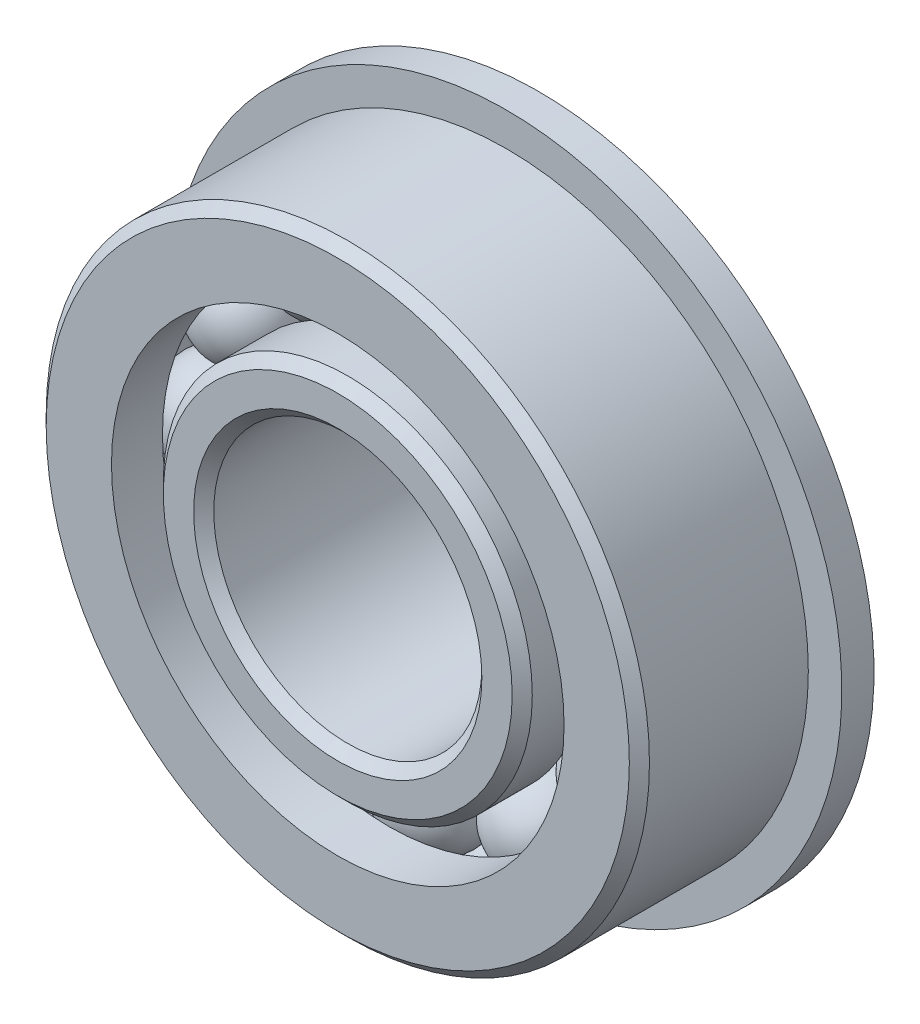
ISO-10303-21;
HEADER;
FILE_DESCRIPTION(('STEP AP214'),'2;1');
FILE_NAME('part.step','',(''),(''),'','','');
FILE_SCHEMA(('AUTOMOTIVE_DESIGN { 1 0 10303 214 1 1 1 1 }'));
ENDSEC;
DATA;
#1=APPLICATION_CONTEXT('core data for automotive mechanical design processes');
#2=APPLICATION_PROTOCOL_DEFINITION('international standard','automotive_design',2000,#1);
#3=PRODUCT_CONTEXT('',#1,'mechanical');
#4=PRODUCT('Part','Part','',(#3));
#5=PRODUCT_RELATED_PRODUCT_CATEGORY('part','',(#4));
#6=PRODUCT_DEFINITION_FORMATION('','',#4);
#7=PRODUCT_DEFINITION_CONTEXT('part definition',#1,'design');
#8=PRODUCT_DEFINITION('design','',#6,#7);
#9=PRODUCT_DEFINITION_SHAPE('','',#8);
#10=(LENGTH_UNIT() NAMED_UNIT(*) SI_UNIT(.MILLI.,.METRE.));
#11=(NAMED_UNIT(*) PLANE_ANGLE_UNIT() SI_UNIT($,.RADIAN.));
#12=(NAMED_UNIT(*) SI_UNIT($,.STERADIAN.) SOLID_ANGLE_UNIT());
#13=UNCERTAINTY_MEASURE_WITH_UNIT(LENGTH_MEASURE(1.E-05),#10,'distance_accuracy_value','');
#14=(GEOMETRIC_REPRESENTATION_CONTEXT(3) GLOBAL_UNCERTAINTY_ASSIGNED_CONTEXT((#13)) GLOBAL_UNIT_ASSIGNED_CONTEXT((#10,
#11,#12)) REPRESENTATION_CONTEXT('',''));
#15=CARTESIAN_POINT('',(0.,0.,0.));
#16=DIRECTION('',(0.,0.,1.));
#17=DIRECTION('',(1.,0.,0.));
#18=AXIS2_PLACEMENT_3D('',#15,#16,#17);
#19=CARTESIAN_POINT('',(-5.15937499999988,8.93629963530074,0.));
#20=DIRECTION('',(0.,0.,1.));
#21=DIRECTION('',(-0.499999999999989,0.866025403784445,0.));
#22=AXIS2_PLACEMENT_3D('',#19,#20,#21);
#23=SPHERICAL_SURFACE('',#22,2.38125);
#24=CARTESIAN_POINT('',(-5.15937499999988,8.93629963530074,2.38125000000001));
#25=VERTEX_POINT('',#24);
#26=VERTEX_LOOP('',#25);
#27=FACE_BOUND('',#26,.T.);
#28=ADVANCED_FACE('F44',(#27),#23,.T.);
#29=CLOSED_SHELL('',(#28));
#30=MANIFOLD_SOLID_BREP('B2',#29);
#31=CARTESIAN_POINT('',(-8.93629963530061,5.1593750000001,0.));
#32=DIRECTION('',(0.,0.,1.));
#33=DIRECTION('',(-0.866025403784433,0.50000000000001,0.));
#34=AXIS2_PLACEMENT_3D('',#31,#32,#33);
#35=SPHERICAL_SURFACE('',#34,2.38125);
#36=CARTESIAN_POINT('',(-8.93629963530061,5.1593750000001,2.38125000000001));
#37=VERTEX_POINT('',#36);
#38=VERTEX_LOOP('',#37);
#39=FACE_BOUND('',#38,.T.);
#40=ADVANCED_FACE('F63',(#39),#35,.T.);
#41=CLOSED_SHELL('',(#40));
#42=MANIFOLD_SOLID_BREP('B6',#41);
#43=CARTESIAN_POINT('',(-10.31875,1.08083169195563E-13,0.));
#44=DIRECTION('',(0.,0.,1.));
#45=DIRECTION('',(-1.,0.,0.));
#46=AXIS2_PLACEMENT_3D('',#43,#44,#45);
#47=SPHERICAL_SURFACE('',#46,2.38125);
#48=CARTESIAN_POINT('',(-10.31875,1.08083169195563E-13,2.38125000000001));
#49=VERTEX_POINT('',#48);
#50=VERTEX_LOOP('',#49);
#51=FACE_BOUND('',#50,.T.);
#52=ADVANCED_FACE('F82',(#51),#47,.T.);
#53=CLOSED_SHELL('',(#52));
#54=MANIFOLD_SOLID_BREP('B40',#53);
#55=CARTESIAN_POINT('',(-8.93629963530072,-5.15937499999992,0.));
#56=DIRECTION('',(0.,0.,1.));
#57=DIRECTION('',(-0.866025403784443,-0.499999999999992,0.));
#58=AXIS2_PLACEMENT_3D('',#55,#56,#57);
#59=SPHERICAL_SURFACE('',#58,2.38125);
#60=CARTESIAN_POINT('',(-8.93629963530072,-5.15937499999992,2.38125000000001));
#61=VERTEX_POINT('',#60);
#62=VERTEX_LOOP('',#61);
#63=FACE_BOUND('',#62,.T.);
#64=ADVANCED_FACE('F101',(#63),#59,.T.);
#65=CLOSED_SHELL('',(#64));
#66=MANIFOLD_SOLID_BREP('B59',#65);
#67=CARTESIAN_POINT('',(-5.15937500000007,-8.93629963530063,0.));
#68=DIRECTION('',(0.,0.,1.));
#69=DIRECTION('',(-0.500000000000007,-0.866025403784435,0.));
#70=AXIS2_PLACEMENT_3D('',#67,#68,#69);
#71=SPHERICAL_SURFACE('',#70,2.38125);
#72=CARTESIAN_POINT('',(-5.15937500000007,-8.93629963530063,2.38125000000001));
#73=VERTEX_POINT('',#72);
#74=VERTEX_LOOP('',#73);
#75=FACE_BOUND('',#74,.T.);
#76=ADVANCED_FACE('F120',(#75),#71,.T.);
#77=CLOSED_SHELL('',(#76));
#78=MANIFOLD_SOLID_BREP('B78',#77);
#79=CARTESIAN_POINT('',(0.,-10.31875,0.));
#80=DIRECTION('',(0.,0.,1.));
#81=DIRECTION('',(0.,-1.,0.));
#82=AXIS2_PLACEMENT_3D('',#79,#80,#81);
#83=SPHERICAL_SURFACE('',#82,2.38125);
#84=CARTESIAN_POINT('',(0.,-10.31875,2.38125000000001));
#85=VERTEX_POINT('',#84);
#86=VERTEX_LOOP('',#85);
#87=FACE_BOUND('',#86,.T.);
#88=ADVANCED_FACE('F139',(#87),#83,.T.);
#89=CLOSED_SHELL('',(#88));
#90=MANIFOLD_SOLID_BREP('B97',#89);
#91=CARTESIAN_POINT('',(5.15937499999995,-8.9362996353007,0.));
#92=DIRECTION('',(0.,0.,1.));
#93=DIRECTION('',(0.499999999999995,-0.866025403784442,0.));
#94=AXIS2_PLACEMENT_3D('',#91,#92,#93);
#95=SPHERICAL_SURFACE('',#94,2.38125);
#96=CARTESIAN_POINT('',(5.15937499999995,-8.9362996353007,2.38125000000001));
#97=VERTEX_POINT('',#96);
#98=VERTEX_LOOP('',#97);
#99=FACE_BOUND('',#98,.T.);
#100=ADVANCED_FACE('F158',(#99),#95,.T.);
#101=CLOSED_SHELL('',(#100));
#102=MANIFOLD_SOLID_BREP('B116',#101);
#103=CARTESIAN_POINT('',(8.93629963530065,-5.15937500000004,0.));
#104=DIRECTION('',(0.,0.,1.));
#105=DIRECTION('',(0.866025403784436,-0.500000000000004,0.));
#106=AXIS2_PLACEMENT_3D('',#103,#104,#105);
#107=SPHERICAL_SURFACE('',#106,2.38125);
#108=CARTESIAN_POINT('',(8.93629963530065,-5.15937500000004,2.38125000000001));
#109=VERTEX_POINT('',#108);
#110=VERTEX_LOOP('',#109);
#111=FACE_BOUND('',#110,.T.);
#112=ADVANCED_FACE('F177',(#111),#107,.T.);
#113=CLOSED_SHELL('',(#112));
#114=MANIFOLD_SOLID_BREP('B135',#113);
#115=CARTESIAN_POINT('',(10.31875,0.,0.));
#116=DIRECTION('',(0.,0.,1.));
#117=DIRECTION('',(1.,0.,0.));
#118=AXIS2_PLACEMENT_3D('',#115,#116,#117);
#119=SPHERICAL_SURFACE('',#118,2.38125);
#120=CARTESIAN_POINT('',(10.31875,0.,2.38125000000001));
#121=VERTEX_POINT('',#120);
#122=VERTEX_LOOP('',#121);
#123=FACE_BOUND('',#122,.T.);
#124=ADVANCED_FACE('F196',(#123),#119,.T.);
#125=CLOSED_SHELL('',(#124));
#126=MANIFOLD_SOLID_BREP('B154',#125);
#127=CARTESIAN_POINT('',(8.93629963530069,5.15937499999998,0.));
#128=DIRECTION('',(0.,0.,1.));
#129=DIRECTION('',(0.86602540378444,0.499999999999998,0.));
#130=AXIS2_PLACEMENT_3D('',#127,#128,#129);
#131=SPHERICAL_SURFACE('',#130,2.38125);
#132=CARTESIAN_POINT('',(8.93629963530069,5.15937499999998,2.38125000000001));
#133=VERTEX_POINT('',#132);
#134=VERTEX_LOOP('',#133);
#135=FACE_BOUND('',#134,.T.);
#136=ADVANCED_FACE('F215',(#135),#131,.T.);
#137=CLOSED_SHELL('',(#136));
#138=MANIFOLD_SOLID_BREP('B173',#137);
#139=CARTESIAN_POINT('',(5.15937500000001,8.93629963530067,0.));
#140=DIRECTION('',(0.,0.,1.));
#141=DIRECTION('',(0.500000000000001,0.866025403784438,0.));
#142=AXIS2_PLACEMENT_3D('',#139,#140,#141);
#143=SPHERICAL_SURFACE('',#142,2.38125);
#144=CARTESIAN_POINT('',(5.15937500000001,8.93629963530067,2.38125000000001));
#145=VERTEX_POINT('',#144);
#146=VERTEX_LOOP('',#145);
#147=FACE_BOUND('',#146,.T.);
#148=ADVANCED_FACE('F234',(#147),#143,.T.);
#149=CLOSED_SHELL('',(#148));
#150=MANIFOLD_SOLID_BREP('B192',#149);
#151=CARTESIAN_POINT('',(0.,10.31875,0.));
#152=DIRECTION('',(0.,0.,1.));
#153=DIRECTION('',(0.,1.,0.));
#154=AXIS2_PLACEMENT_3D('',#151,#152,#153);
#155=SPHERICAL_SURFACE('',#154,2.38125);
#156=CARTESIAN_POINT('',(0.,10.31875,2.38125000000001));
#157=VERTEX_POINT('',#156);
#158=VERTEX_LOOP('',#157);
#159=FACE_BOUND('',#158,.T.);
#160=ADVANCED_FACE('F255',(#159),#155,.T.);
#161=CLOSED_SHELL('',(#160));
#162=MANIFOLD_SOLID_BREP('B211',#161);
#163=CARTESIAN_POINT('',(0.,0.,4.28625));
#164=DIRECTION('',(0.,0.,-1.));
#165=DIRECTION('',(-1.,0.,0.));
#166=AXIS2_PLACEMENT_3D('',#163,#164,#165);
#167=CONICAL_SURFACE('',#166,8.7376,0.785398163397446);
#168=CARTESIAN_POINT('',(0.,0.,4.7625));
#169=DIRECTION('',(0.,0.,1.));
#170=DIRECTION('',(1.,0.,0.));
#171=AXIS2_PLACEMENT_3D('',#168,#169,#170);
#172=CIRCLE('',#171,8.26135);
#173=CARTESIAN_POINT('',(8.26135,0.,4.7625));
#174=VERTEX_POINT('',#173);
#175=EDGE_CURVE('E254',#174,#174,#172,.T.);
#176=ORIENTED_EDGE('',*,*,#175,.F.);
#177=EDGE_LOOP('',(#176));
#178=FACE_BOUND('',#177,.T.);
#179=CARTESIAN_POINT('',(0.,0.,4.28625));
#180=DIRECTION('',(0.,0.,1.));
#181=DIRECTION('',(1.,0.,0.));
#182=AXIS2_PLACEMENT_3D('',#179,#180,#181);
#183=CIRCLE('',#182,8.7376);
#184=CARTESIAN_POINT('',(8.7376,0.,4.28625));
#185=VERTEX_POINT('',#184);
#186=EDGE_CURVE('E307',#185,#185,#183,.T.);
#187=ORIENTED_EDGE('',*,*,#186,.T.);
#188=EDGE_LOOP('',(#187));
#189=FACE_BOUND('',#188,.T.);
#190=ADVANCED_FACE('F273',(#178,#189),#167,.T.);
#191=CARTESIAN_POINT('',(0.,6.82625,4.7625));
#192=DIRECTION('',(0.,0.,-1.));
#193=DIRECTION('',(-1.,0.,0.));
#194=AXIS2_PLACEMENT_3D('',#191,#192,#193);
#195=PLANE('',#194);
#196=CARTESIAN_POINT('',(0.,0.,4.7625));
#197=DIRECTION('',(0.,0.,1.));
#198=DIRECTION('',(1.,0.,0.));
#199=AXIS2_PLACEMENT_3D('',#196,#197,#198);
#200=CIRCLE('',#199,6.82625);
#201=CARTESIAN_POINT('',(6.82625,0.,4.7625));
#202=VERTEX_POINT('',#201);
#203=EDGE_CURVE('E279',#202,#202,#200,.T.);
#204=ORIENTED_EDGE('',*,*,#203,.F.);
#205=EDGE_LOOP('',(#204));
#206=FACE_BOUND('',#205,.T.);
#207=ORIENTED_EDGE('',*,*,#175,.T.);
#208=EDGE_LOOP('',(#207));
#209=FACE_BOUND('',#208,.T.);
#210=ADVANCED_FACE('F356',(#206,#209),#195,.F.);
#211=CARTESIAN_POINT('',(0.,0.,4.7625));
#212=DIRECTION('',(0.,0.,1.));
#213=DIRECTION('',(1.,0.,0.));
#214=AXIS2_PLACEMENT_3D('',#211,#212,#213);
#215=CONICAL_SURFACE('',#214,6.82625,0.785398163397449);
#216=CARTESIAN_POINT('',(0.,0.,4.28625));
#217=DIRECTION('',(0.,0.,1.));
#218=DIRECTION('',(1.,0.,0.));
#219=AXIS2_PLACEMENT_3D('',#216,#217,#218);
#220=CIRCLE('',#219,6.35);
#221=CARTESIAN_POINT('',(6.35,0.,4.28625));
#222=VERTEX_POINT('',#221);
#223=EDGE_CURVE('E283',#222,#222,#220,.T.);
#224=ORIENTED_EDGE('',*,*,#223,.F.);
#225=EDGE_LOOP('',(#224));
#226=FACE_BOUND('',#225,.T.);
#227=ORIENTED_EDGE('',*,*,#203,.T.);
#228=EDGE_LOOP('',(#227));
#229=FACE_BOUND('',#228,.T.);
#230=ADVANCED_FACE('F351',(#226,#229),#215,.F.);
#231=CARTESIAN_POINT('',(0.,0.,4.7625));
#232=DIRECTION('',(0.,0.,1.));
#233=DIRECTION('',(1.,0.,0.));
#234=AXIS2_PLACEMENT_3D('',#231,#232,#233);
#235=CYLINDRICAL_SURFACE('',#234,6.35);
#236=CARTESIAN_POINT('',(0.,0.,-5.88645));
#237=DIRECTION('',(0.,0.,1.));
#238=DIRECTION('',(1.,0.,0.));
#239=AXIS2_PLACEMENT_3D('',#236,#237,#238);
#240=CIRCLE('',#239,6.35);
#241=CARTESIAN_POINT('',(6.35,0.,-5.88645));
#242=VERTEX_POINT('',#241);
#243=EDGE_CURVE('E287',#242,#242,#240,.T.);
#244=ORIENTED_EDGE('',*,*,#243,.F.);
#245=EDGE_LOOP('',(#244));
#246=FACE_BOUND('',#245,.T.);
#247=ORIENTED_EDGE('',*,*,#223,.T.);
#248=EDGE_LOOP('',(#247));
#249=FACE_BOUND('',#248,.T.);
#250=ADVANCED_FACE('F345',(#246,#249),#235,.F.);
#251=CARTESIAN_POINT('',(0.,0.,-5.88645));
#252=DIRECTION('',(0.,0.,-1.));
#253=DIRECTION('',(-1.,0.,0.));
#254=AXIS2_PLACEMENT_3D('',#251,#252,#253);
#255=CONICAL_SURFACE('',#254,6.35,0.785398163397448);
#256=CARTESIAN_POINT('',(0.,0.,-6.3627));
#257=DIRECTION('',(0.,0.,1.));
#258=DIRECTION('',(1.,0.,0.));
#259=AXIS2_PLACEMENT_3D('',#256,#257,#258);
#260=CIRCLE('',#259,6.82625);
#261=CARTESIAN_POINT('',(6.82625,0.,-6.3627));
#262=VERTEX_POINT('',#261);
#263=EDGE_CURVE('E292',#262,#262,#260,.T.);
#264=ORIENTED_EDGE('',*,*,#263,.F.);
#265=EDGE_LOOP('',(#264));
#266=FACE_BOUND('',#265,.T.);
#267=ORIENTED_EDGE('',*,*,#243,.T.);
#268=EDGE_LOOP('',(#267));
#269=FACE_BOUND('',#268,.T.);
#270=ADVANCED_FACE('F339',(#266,#269),#255,.F.);
#271=CARTESIAN_POINT('',(0.,8.26135,-6.3627));
#272=DIRECTION('',(0.,0.,1.));
#273=DIRECTION('',(1.,0.,0.));
#274=AXIS2_PLACEMENT_3D('',#271,#272,#273);
#275=PLANE('',#274);
#276=CARTESIAN_POINT('',(0.,0.,-6.3627));
#277=DIRECTION('',(0.,0.,1.));
#278=DIRECTION('',(1.,0.,0.));
#279=AXIS2_PLACEMENT_3D('',#276,#277,#278);
#280=CIRCLE('',#279,8.26135);
#281=CARTESIAN_POINT('',(8.26135,0.,-6.3627));
#282=VERTEX_POINT('',#281);
#283=EDGE_CURVE('E295',#282,#282,#280,.T.);
#284=ORIENTED_EDGE('',*,*,#283,.F.);
#285=EDGE_LOOP('',(#284));
#286=FACE_BOUND('',#285,.T.);
#287=ORIENTED_EDGE('',*,*,#263,.T.);
#288=EDGE_LOOP('',(#287));
#289=FACE_BOUND('',#288,.T.);
#290=ADVANCED_FACE('F333',(#286,#289),#275,.F.);
#291=CARTESIAN_POINT('',(0.,0.,-6.3627));
#292=DIRECTION('',(0.,0.,1.));
#293=DIRECTION('',(1.,0.,0.));
#294=AXIS2_PLACEMENT_3D('',#291,#292,#293);
#295=CONICAL_SURFACE('',#294,8.26135,0.785398163397447);
#296=CARTESIAN_POINT('',(0.,0.,-5.88645));
#297=DIRECTION('',(0.,0.,1.));
#298=DIRECTION('',(1.,0.,0.));
#299=AXIS2_PLACEMENT_3D('',#296,#297,#298);
#300=CIRCLE('',#299,8.7376);
#301=CARTESIAN_POINT('',(8.7376,0.,-5.88645));
#302=VERTEX_POINT('',#301);
#303=EDGE_CURVE('E298',#302,#302,#300,.T.);
#304=ORIENTED_EDGE('',*,*,#303,.F.);
#305=EDGE_LOOP('',(#304));
#306=FACE_BOUND('',#305,.T.);
#307=ORIENTED_EDGE('',*,*,#283,.T.);
#308=EDGE_LOOP('',(#307));
#309=FACE_BOUND('',#308,.T.);
#310=ADVANCED_FACE('F327',(#306,#309),#295,.T.);
#311=CARTESIAN_POINT('',(0.,0.,4.7625));
#312=DIRECTION('',(0.,0.,1.));
#313=DIRECTION('',(1.,0.,0.));
#314=AXIS2_PLACEMENT_3D('',#311,#312,#313);
#315=CYLINDRICAL_SURFACE('',#314,8.7376);
#316=CARTESIAN_POINT('',(0.,0.,-1.78053818830151));
#317=DIRECTION('',(0.,0.,1.));
#318=DIRECTION('',(1.,0.,0.));
#319=AXIS2_PLACEMENT_3D('',#316,#317,#318);
#320=CIRCLE('',#319,8.7376);
#321=CARTESIAN_POINT('',(8.7376,0.,-1.78053818830151));
#322=VERTEX_POINT('',#321);
#323=EDGE_CURVE('E301',#322,#322,#320,.T.);
#324=ORIENTED_EDGE('',*,*,#323,.F.);
#325=EDGE_LOOP('',(#324));
#326=FACE_BOUND('',#325,.T.);
#327=ORIENTED_EDGE('',*,*,#303,.T.);
#328=EDGE_LOOP('',(#327));
#329=FACE_BOUND('',#328,.T.);
#330=ADVANCED_FACE('F321',(#326,#329),#315,.T.);
#331=CARTESIAN_POINT('',(0.,0.,0.));
#332=DIRECTION('',(0.,0.,1.));
#333=DIRECTION('',(1.,0.,0.));
#334=AXIS2_PLACEMENT_3D('',#331,#332,#333);
#335=TOROIDAL_SURFACE('',#334,10.31875,2.38125);
#336=CARTESIAN_POINT('',(0.,0.,1.78053818830151));
#337=DIRECTION('',(0.,0.,1.));
#338=DIRECTION('',(1.,0.,0.));
#339=AXIS2_PLACEMENT_3D('',#336,#337,#338);
#340=CIRCLE('',#339,8.7376);
#341=CARTESIAN_POINT('',(8.7376,0.,1.78053818830151));
#342=VERTEX_POINT('',#341);
#343=EDGE_CURVE('E304',#342,#342,#340,.T.);
#344=ORIENTED_EDGE('',*,*,#343,.F.);
#345=EDGE_LOOP('',(#344));
#346=FACE_BOUND('',#345,.T.);
#347=ORIENTED_EDGE('',*,*,#323,.T.);
#348=EDGE_LOOP('',(#347));
#349=FACE_BOUND('',#348,.T.);
#350=ADVANCED_FACE('F315',(#346,#349),#335,.F.);
#351=CARTESIAN_POINT('',(0.,0.,4.7625));
#352=DIRECTION('',(0.,0.,1.));
#353=DIRECTION('',(1.,0.,0.));
#354=AXIS2_PLACEMENT_3D('',#351,#352,#353);
#355=CYLINDRICAL_SURFACE('',#354,8.7376);
#356=ORIENTED_EDGE('',*,*,#186,.F.);
#357=EDGE_LOOP('',(#356));
#358=FACE_BOUND('',#357,.T.);
#359=ORIENTED_EDGE('',*,*,#343,.T.);
#360=EDGE_LOOP('',(#359));
#361=FACE_BOUND('',#360,.T.);
#362=ADVANCED_FACE('F312',(#358,#361),#355,.T.);
#363=CLOSED_SHELL('',(#190,#210,#230,#250,#270,#290,#310,#330,#350,#362));
#364=MANIFOLD_SOLID_BREP('B230',#363);
#365=CARTESIAN_POINT('',(0.,0.,4.28625));
#366=DIRECTION('',(0.,0.,-1.));
#367=DIRECTION('',(-1.,0.,0.));
#368=AXIS2_PLACEMENT_3D('',#365,#366,#367);
#369=CONICAL_SURFACE('',#368,14.2875,0.785398163397445);
#370=CARTESIAN_POINT('',(0.,0.,4.7625));
#371=DIRECTION('',(0.,0.,1.));
#372=DIRECTION('',(1.,0.,0.));
#373=AXIS2_PLACEMENT_3D('',#370,#371,#372);
#374=CIRCLE('',#373,13.81125);
#375=CARTESIAN_POINT('',(13.81125,0.,4.7625));
#376=VERTEX_POINT('',#375);
#377=EDGE_CURVE('E427',#376,#376,#374,.T.);
#378=ORIENTED_EDGE('',*,*,#377,.F.);
#379=EDGE_LOOP('',(#378));
#380=FACE_BOUND('',#379,.T.);
#381=CARTESIAN_POINT('',(0.,0.,4.28625));
#382=DIRECTION('',(0.,0.,1.));
#383=DIRECTION('',(1.,0.,0.));
#384=AXIS2_PLACEMENT_3D('',#381,#382,#383);
#385=CIRCLE('',#384,14.2875);
#386=CARTESIAN_POINT('',(14.2875,0.,4.28625));
#387=VERTEX_POINT('',#386);
#388=EDGE_CURVE('E272',#387,#387,#385,.T.);
#389=ORIENTED_EDGE('',*,*,#388,.T.);
#390=EDGE_LOOP('',(#389));
#391=FACE_BOUND('',#390,.T.);
#392=ADVANCED_FACE('F405',(#380,#391),#369,.T.);
#393=CARTESIAN_POINT('',(0.,0.,4.7625));
#394=DIRECTION('',(0.,0.,1.));
#395=DIRECTION('',(1.,0.,0.));
#396=AXIS2_PLACEMENT_3D('',#393,#394,#395);
#397=CYLINDRICAL_SURFACE('',#396,14.2875);
#398=CARTESIAN_POINT('',(0.,0.,-3.2385));
#399=DIRECTION('',(0.,0.,1.));
#400=DIRECTION('',(1.,0.,0.));
#401=AXIS2_PLACEMENT_3D('',#398,#399,#400);
#402=CIRCLE('',#401,14.2875);
#403=CARTESIAN_POINT('',(14.2875,0.,-3.2385));
#404=VERTEX_POINT('',#403);
#405=EDGE_CURVE('E430',#404,#404,#402,.T.);
#406=ORIENTED_EDGE('',*,*,#405,.T.);
#407=EDGE_LOOP('',(#406));
#408=FACE_BOUND('',#407,.T.);
#409=ORIENTED_EDGE('',*,*,#388,.F.);
#410=EDGE_LOOP('',(#409));
#411=FACE_BOUND('',#410,.T.);
#412=ADVANCED_FACE('F450',(#408,#411),#397,.T.);
#413=CARTESIAN_POINT('',(0.,13.81125,-4.7625));
#414=DIRECTION('',(0.,0.,1.));
#415=DIRECTION('',(1.,0.,0.));
#416=AXIS2_PLACEMENT_3D('',#413,#414,#415);
#417=PLANE('',#416);
#418=CARTESIAN_POINT('',(0.,0.,-4.7625));
#419=DIRECTION('',(0.,0.,1.));
#420=DIRECTION('',(1.,0.,0.));
#421=AXIS2_PLACEMENT_3D('',#418,#419,#420);
#422=CIRCLE('',#421,10.7188);
#423=CARTESIAN_POINT('',(10.7188,0.,-4.7625));
#424=VERTEX_POINT('',#423);
#425=EDGE_CURVE('E411',#424,#424,#422,.T.);
#426=ORIENTED_EDGE('',*,*,#425,.T.);
#427=EDGE_LOOP('',(#426));
#428=FACE_BOUND('',#427,.T.);
#429=CARTESIAN_POINT('',(0.,0.,-4.7625));
#430=DIRECTION('',(0.,0.,-1.));
#431=DIRECTION('',(-1.,0.,0.));
#432=AXIS2_PLACEMENT_3D('',#429,#430,#431);
#433=CIRCLE('',#432,15.875);
#434=CARTESIAN_POINT('',(-15.875,0.,-4.7625));
#435=VERTEX_POINT('',#434);
#436=EDGE_CURVE('E433',#435,#435,#433,.T.);
#437=ORIENTED_EDGE('',*,*,#436,.T.);
#438=EDGE_LOOP('',(#437));
#439=FACE_BOUND('',#438,.T.);
#440=ADVANCED_FACE('F453',(#428,#439),#417,.F.);
#441=CARTESIAN_POINT('',(0.,0.,4.7625));
#442=DIRECTION('',(0.,0.,1.));
#443=DIRECTION('',(1.,0.,0.));
#444=AXIS2_PLACEMENT_3D('',#441,#442,#443);
#445=CYLINDRICAL_SURFACE('',#444,10.7188);
#446=CARTESIAN_POINT('',(0.,0.,-2.34740528243421));
#447=DIRECTION('',(0.,0.,1.));
#448=DIRECTION('',(1.,0.,0.));
#449=AXIS2_PLACEMENT_3D('',#446,#447,#448);
#450=CIRCLE('',#449,10.7188);
#451=CARTESIAN_POINT('',(10.7188,0.,-2.34740528243421));
#452=VERTEX_POINT('',#451);
#453=EDGE_CURVE('E415',#452,#452,#450,.T.);
#454=ORIENTED_EDGE('',*,*,#453,.T.);
#455=EDGE_LOOP('',(#454));
#456=FACE_BOUND('',#455,.T.);
#457=ORIENTED_EDGE('',*,*,#425,.F.);
#458=EDGE_LOOP('',(#457));
#459=FACE_BOUND('',#458,.T.);
#460=ADVANCED_FACE('F458',(#456,#459),#445,.F.);
#461=CARTESIAN_POINT('',(0.,0.,0.));
#462=DIRECTION('',(0.,0.,1.));
#463=DIRECTION('',(1.,0.,0.));
#464=AXIS2_PLACEMENT_3D('',#461,#462,#463);
#465=TOROIDAL_SURFACE('',#464,10.31875,2.38125);
#466=ORIENTED_EDGE('',*,*,#453,.F.);
#467=EDGE_LOOP('',(#466));
#468=FACE_BOUND('',#467,.T.);
#469=CARTESIAN_POINT('',(0.,0.,2.34740528243421));
#470=DIRECTION('',(0.,0.,1.));
#471=DIRECTION('',(1.,0.,0.));
#472=AXIS2_PLACEMENT_3D('',#469,#470,#471);
#473=CIRCLE('',#472,10.7188);
#474=CARTESIAN_POINT('',(10.7188,0.,2.34740528243421));
#475=VERTEX_POINT('',#474);
#476=EDGE_CURVE('E419',#475,#475,#473,.T.);
#477=ORIENTED_EDGE('',*,*,#476,.T.);
#478=EDGE_LOOP('',(#477));
#479=FACE_BOUND('',#478,.T.);
#480=ADVANCED_FACE('F465',(#468,#479),#465,.F.);
#481=CARTESIAN_POINT('',(0.,0.,4.7625));
#482=DIRECTION('',(0.,0.,1.));
#483=DIRECTION('',(1.,0.,0.));
#484=AXIS2_PLACEMENT_3D('',#481,#482,#483);
#485=CYLINDRICAL_SURFACE('',#484,10.7188);
#486=ORIENTED_EDGE('',*,*,#476,.F.);
#487=EDGE_LOOP('',(#486));
#488=FACE_BOUND('',#487,.T.);
#489=CARTESIAN_POINT('',(0.,0.,4.7625));
#490=DIRECTION('',(0.,0.,1.));
#491=DIRECTION('',(1.,0.,0.));
#492=AXIS2_PLACEMENT_3D('',#489,#490,#491);
#493=CIRCLE('',#492,10.7188);
#494=CARTESIAN_POINT('',(10.7188,0.,4.7625));
#495=VERTEX_POINT('',#494);
#496=EDGE_CURVE('E424',#495,#495,#493,.T.);
#497=ORIENTED_EDGE('',*,*,#496,.T.);
#498=EDGE_LOOP('',(#497));
#499=FACE_BOUND('',#498,.T.);
#500=ADVANCED_FACE('F469',(#488,#499),#485,.F.);
#501=CARTESIAN_POINT('',(0.,13.81125,4.7625));
#502=DIRECTION('',(0.,0.,-1.));
#503=DIRECTION('',(-1.,0.,0.));
#504=AXIS2_PLACEMENT_3D('',#501,#502,#503);
#505=PLANE('',#504);
#506=ORIENTED_EDGE('',*,*,#496,.F.);
#507=EDGE_LOOP('',(#506));
#508=FACE_BOUND('',#507,.T.);
#509=ORIENTED_EDGE('',*,*,#377,.T.);
#510=EDGE_LOOP('',(#509));
#511=FACE_BOUND('',#510,.T.);
#512=ADVANCED_FACE('F446',(#508,#511),#505,.F.);
#513=CARTESIAN_POINT('',(0.,10.7188,-3.2385));
#514=DIRECTION('',(0.,0.,1.));
#515=DIRECTION('',(1.,0.,0.));
#516=AXIS2_PLACEMENT_3D('',#513,#514,#515);
#517=PLANE('',#516);
#518=CARTESIAN_POINT('',(0.,0.,-3.2385));
#519=DIRECTION('',(0.,0.,-1.));
#520=DIRECTION('',(-1.,0.,0.));
#521=AXIS2_PLACEMENT_3D('',#518,#519,#520);
#522=CIRCLE('',#521,15.875);
#523=CARTESIAN_POINT('',(-15.875,0.,-3.2385));
#524=VERTEX_POINT('',#523);
#525=EDGE_CURVE('E436',#524,#524,#522,.T.);
#526=ORIENTED_EDGE('',*,*,#525,.F.);
#527=EDGE_LOOP('',(#526));
#528=FACE_BOUND('',#527,.T.);
#529=ORIENTED_EDGE('',*,*,#405,.F.);
#530=EDGE_LOOP('',(#529));
#531=FACE_BOUND('',#530,.T.);
#532=ADVANCED_FACE('F443',(#528,#531),#517,.T.);
#533=CARTESIAN_POINT('',(0.,0.,-4.7625));
#534=DIRECTION('',(0.,0.,-1.));
#535=DIRECTION('',(-1.,0.,0.));
#536=AXIS2_PLACEMENT_3D('',#533,#534,#535);
#537=CYLINDRICAL_SURFACE('',#536,15.875);
#538=ORIENTED_EDGE('',*,*,#525,.T.);
#539=EDGE_LOOP('',(#538));
#540=FACE_BOUND('',#539,.T.);
#541=ORIENTED_EDGE('',*,*,#436,.F.);
#542=EDGE_LOOP('',(#541));
#543=FACE_BOUND('',#542,.T.);
#544=ADVANCED_FACE('F440',(#540,#543),#537,.T.);
#545=CLOSED_SHELL('',(#392,#412,#440,#460,#480,#500,#512,#532,#544));
#546=MANIFOLD_SOLID_BREP('B249',#545);
#547=ADVANCED_BREP_SHAPE_REPRESENTATION('',(#18,#30,#42,#54,#66,#78,#90,#102,#114,#126,#138,
#150,#162,#364,#546),#14);
#548=SHAPE_DEFINITION_REPRESENTATION(#9,#547);
ENDSEC;
END-ISO-10303-21;
